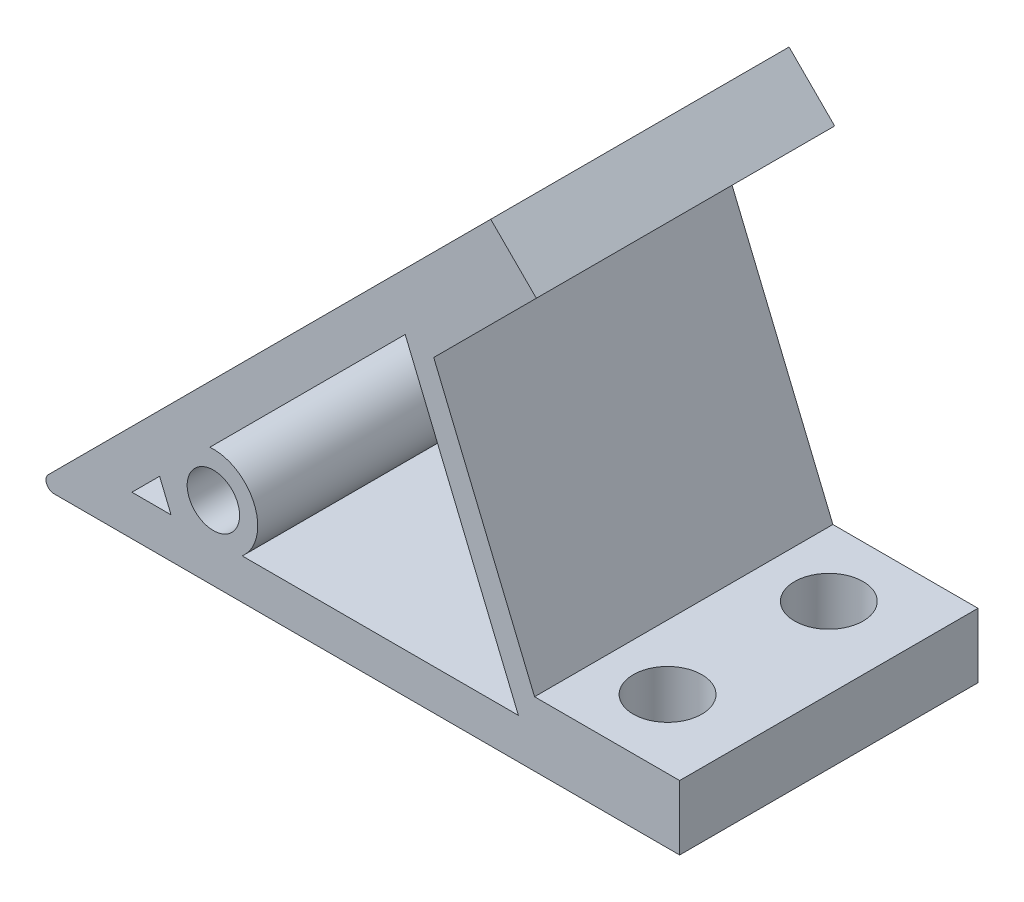
ISO-10303-21;
HEADER;
FILE_DESCRIPTION(('STEP AP214'),'2;1');
FILE_NAME('part.step','',(''),(''),'','','');
FILE_SCHEMA(('AUTOMOTIVE_DESIGN { 1 0 10303 214 1 1 1 1 }'));
ENDSEC;
DATA;
#1=APPLICATION_CONTEXT('core data for automotive mechanical design processes');
#2=APPLICATION_PROTOCOL_DEFINITION('international standard','automotive_design',2000,#1);
#3=PRODUCT_CONTEXT('',#1,'mechanical');
#4=PRODUCT('Part','Part','',(#3));
#5=PRODUCT_RELATED_PRODUCT_CATEGORY('part','',(#4));
#6=PRODUCT_DEFINITION_FORMATION('','',#4);
#7=PRODUCT_DEFINITION_CONTEXT('part definition',#1,'design');
#8=PRODUCT_DEFINITION('design','',#6,#7);
#9=PRODUCT_DEFINITION_SHAPE('','',#8);
#10=(LENGTH_UNIT() NAMED_UNIT(*) SI_UNIT(.MILLI.,.METRE.));
#11=(NAMED_UNIT(*) PLANE_ANGLE_UNIT() SI_UNIT($,.RADIAN.));
#12=(NAMED_UNIT(*) SI_UNIT($,.STERADIAN.) SOLID_ANGLE_UNIT());
#13=UNCERTAINTY_MEASURE_WITH_UNIT(LENGTH_MEASURE(1.E-05),#10,'distance_accuracy_value','');
#14=(GEOMETRIC_REPRESENTATION_CONTEXT(3) GLOBAL_UNCERTAINTY_ASSIGNED_CONTEXT((#13)) GLOBAL_UNIT_ASSIGNED_CONTEXT((#10,
#11,#12)) REPRESENTATION_CONTEXT('',''));
#15=CARTESIAN_POINT('',(0.,0.,0.));
#16=DIRECTION('',(0.,0.,1.));
#17=DIRECTION('',(1.,0.,0.));
#18=AXIS2_PLACEMENT_3D('',#15,#16,#17);
#19=CARTESIAN_POINT('',(-30.4993179415646,38.1869735594505,18.5));
#20=DIRECTION('',(-0.707106781186548,0.707106781186547,0.));
#21=DIRECTION('',(-0.707106781186547,-0.707106781186548,0.));
#22=AXIS2_PLACEMENT_3D('',#19,#20,#21);
#23=PLANE('',#22);
#24=CARTESIAN_POINT('',(-24.8456710674491,43.8406204335659,10.));
#25=DIRECTION('',(-0.70710678118655,0.707106781186545,0.));
#26=DIRECTION('',(-0.707106781186546,-0.707106781186549,0.));
#27=AXIS2_PLACEMENT_3D('',#24,#25,#26);
#28=CIRCLE('',#27,4.25);
#29=CARTESIAN_POINT('',(-27.8508748874919,40.8354166135231,10.));
#30=VERTEX_POINT('',#29);
#31=EDGE_CURVE('E263',#30,#30,#28,.T.);
#32=ORIENTED_EDGE('',*,*,#31,.T.);
#33=EDGE_LOOP('',(#32));
#34=FACE_BOUND('',#33,.T.);
#35=DIRECTION('',(0.707106781186547,0.707106781186548,0.));
#36=VECTOR('',#35,1.);
#37=CARTESIAN_POINT('',(-30.4993179415646,38.1869735594505,-18.5));
#38=LINE('',#37,#36);
#39=CARTESIAN_POINT('',(-30.4993179415646,38.1869735594505,-18.5));
#40=VERTEX_POINT('',#39);
#41=CARTESIAN_POINT('',(-17.7746032555838,50.9116882454314,-18.5));
#42=VERTEX_POINT('',#41);
#43=EDGE_CURVE('E237',#40,#42,#38,.T.);
#44=ORIENTED_EDGE('',*,*,#43,.T.);
#45=DIRECTION('',(0.,0.,-1.));
#46=VECTOR('',#45,1.);
#47=CARTESIAN_POINT('',(-17.7746032555838,50.9116882454314,18.5));
#48=LINE('',#47,#46);
#49=CARTESIAN_POINT('',(-17.7746032555838,50.9116882454314,18.5));
#50=VERTEX_POINT('',#49);
#51=EDGE_CURVE('E247',#50,#42,#48,.T.);
#52=ORIENTED_EDGE('',*,*,#51,.F.);
#53=DIRECTION('',(0.707106781186547,0.707106781186548,0.));
#54=VECTOR('',#53,1.);
#55=CARTESIAN_POINT('',(-30.4993179415646,38.1869735594505,18.5));
#56=LINE('',#55,#54);
#57=CARTESIAN_POINT('',(-30.4993179415646,38.1869735594505,18.5));
#58=VERTEX_POINT('',#57);
#59=EDGE_CURVE('E220',#58,#50,#56,.T.);
#60=ORIENTED_EDGE('',*,*,#59,.F.);
#61=DIRECTION('',(0.,0.,-1.));
#62=VECTOR('',#61,1.);
#63=CARTESIAN_POINT('',(-30.4993179415646,38.1869735594505,18.5));
#64=LINE('',#63,#62);
#65=EDGE_CURVE('E250',#58,#40,#64,.T.);
#66=ORIENTED_EDGE('',*,*,#65,.T.);
#67=EDGE_LOOP('',(#44,#52,#60,#66));
#68=FACE_BOUND('',#67,.T.);
#69=CARTESIAN_POINT('',(-24.8456710674491,43.8406204335659,-9.99999999999999));
#70=DIRECTION('',(-0.70710678118655,0.707106781186545,0.));
#71=DIRECTION('',(0.707106781186546,0.707106781186549,0.));
#72=AXIS2_PLACEMENT_3D('',#69,#70,#71);
#73=CIRCLE('',#72,4.25);
#74=CARTESIAN_POINT('',(-21.8404672474063,46.8458242536088,-9.99999999999999));
#75=VERTEX_POINT('',#74);
#76=EDGE_CURVE('E274',#75,#75,#73,.T.);
#77=ORIENTED_EDGE('',*,*,#76,.T.);
#78=EDGE_LOOP('',(#77));
#79=FACE_BOUND('',#78,.T.);
#80=ADVANCED_FACE('F35',(#34,#68,#79),#23,.F.);
#81=CARTESIAN_POINT('',(-78.2928932188134,1.7071067811866,18.5));
#82=DIRECTION('',(0.707106781186548,-0.707106781186547,0.));
#83=DIRECTION('',(0.707106781186547,0.707106781186548,0.));
#84=AXIS2_PLACEMENT_3D('',#81,#82,#83);
#85=PLANE('',#84);
#86=CARTESIAN_POINT('',(-30.5025253169416,49.4974746830584,10.));
#87=DIRECTION('',(0.707106781186548,-0.707106781186547,0.));
#88=DIRECTION('',(0.707106781186547,0.707106781186548,0.));
#89=AXIS2_PLACEMENT_3D('',#86,#87,#88);
#90=CIRCLE('',#89,4.25);
#91=CARTESIAN_POINT('',(-27.4973214968988,52.5026785031012,10.));
#92=VERTEX_POINT('',#91);
#93=EDGE_CURVE('E260',#92,#92,#90,.F.);
#94=ORIENTED_EDGE('',*,*,#93,.F.);
#95=EDGE_LOOP('',(#94));
#96=FACE_BOUND('',#95,.T.);
#97=DIRECTION('',(-0.707106781186547,-0.707106781186548,0.));
#98=VECTOR('',#97,1.);
#99=CARTESIAN_POINT('',(-78.2928932188134,1.7071067811866,-18.5));
#100=LINE('',#99,#98);
#101=CARTESIAN_POINT('',(-23.4314575050762,56.5685424949238,-18.5));
#102=VERTEX_POINT('',#101);
#103=CARTESIAN_POINT('',(-78.2928932188134,1.7071067811866,-18.5));
#104=VERTEX_POINT('',#103);
#105=EDGE_CURVE('E212',#102,#104,#100,.T.);
#106=ORIENTED_EDGE('',*,*,#105,.T.);
#107=DIRECTION('',(0.,0.,-1.));
#108=VECTOR('',#107,1.);
#109=CARTESIAN_POINT('',(-78.2928932188134,1.7071067811866,18.5));
#110=LINE('',#109,#108);
#111=CARTESIAN_POINT('',(-78.2928932188134,1.7071067811866,18.5));
#112=VERTEX_POINT('',#111);
#113=EDGE_CURVE('E226',#112,#104,#110,.T.);
#114=ORIENTED_EDGE('',*,*,#113,.F.);
#115=DIRECTION('',(-0.707106781186547,-0.707106781186548,0.));
#116=VECTOR('',#115,1.);
#117=CARTESIAN_POINT('',(-78.2928932188134,1.7071067811866,18.5));
#118=LINE('',#117,#116);
#119=CARTESIAN_POINT('',(-23.4314575050762,56.5685424949238,18.5));
#120=VERTEX_POINT('',#119);
#121=EDGE_CURVE('E224',#120,#112,#118,.T.);
#122=ORIENTED_EDGE('',*,*,#121,.F.);
#123=DIRECTION('',(0.,0.,-1.));
#124=VECTOR('',#123,1.);
#125=CARTESIAN_POINT('',(-23.4314575050762,56.5685424949238,18.5));
#126=LINE('',#125,#124);
#127=EDGE_CURVE('E244',#120,#102,#126,.T.);
#128=ORIENTED_EDGE('',*,*,#127,.T.);
#129=EDGE_LOOP('',(#106,#114,#122,#128));
#130=FACE_BOUND('',#129,.T.);
#131=CARTESIAN_POINT('',(-30.5025253169416,49.4974746830584,-9.99999999999999));
#132=DIRECTION('',(0.707106781186548,-0.707106781186547,0.));
#133=DIRECTION('',(0.707106781186547,0.707106781186548,0.));
#134=AXIS2_PLACEMENT_3D('',#131,#132,#133);
#135=CIRCLE('',#134,4.25);
#136=CARTESIAN_POINT('',(-27.4973214968988,52.5026785031012,-9.99999999999999));
#137=VERTEX_POINT('',#136);
#138=EDGE_CURVE('E39',#137,#137,#135,.F.);
#139=ORIENTED_EDGE('',*,*,#138,.F.);
#140=EDGE_LOOP('',(#139));
#141=FACE_BOUND('',#140,.T.);
#142=ADVANCED_FACE('F308',(#96,#130,#141),#85,.F.);
#143=CARTESIAN_POINT('',(-77.5857864376269,1.,18.5));
#144=DIRECTION('',(0.,0.,1.));
#145=DIRECTION('',(1.,0.,0.));
#146=AXIS2_PLACEMENT_3D('',#143,#144,#145);
#147=PLANE('',#146);
#148=DIRECTION('',(1.,0.,0.));
#149=VECTOR('',#148,1.);
#150=CARTESIAN_POINT('',(-54.2574687525298,5.,18.5));
#151=LINE('',#150,#149);
#152=CARTESIAN_POINT('',(-54.2574687525298,5.,18.5));
#153=VERTEX_POINT('',#152);
#154=CARTESIAN_POINT('',(-20.,5.,18.5));
#155=VERTEX_POINT('',#154);
#156=EDGE_CURVE('E152',#153,#155,#151,.T.);
#157=ORIENTED_EDGE('',*,*,#156,.F.);
#158=CARTESIAN_POINT('',(-57.8268912197291,9.18440237676214,18.5));
#159=DIRECTION('',(0.,0.,-1.));
#160=DIRECTION('',(1.,0.,0.));
#161=AXIS2_PLACEMENT_3D('',#158,#159,#160);
#162=CIRCLE('',#161,5.49999999999996);
#163=CARTESIAN_POINT('',(-58.2617476840749,14.6671845040599,18.5));
#164=VERTEX_POINT('',#163);
#165=EDGE_CURVE('E144',#164,#153,#162,.T.);
#166=ORIENTED_EDGE('',*,*,#165,.F.);
#167=DIRECTION('',(-0.707106781186549,-0.707106781186546,0.));
#168=VECTOR('',#167,1.);
#169=CARTESIAN_POINT('',(-58.2617476840749,14.6671845040599,18.5));
#170=LINE('',#169,#168);
#171=CARTESIAN_POINT('',(-34.0380592228744,38.8908729652603,18.5));
#172=VERTEX_POINT('',#171);
#173=EDGE_CURVE('E168',#172,#164,#170,.T.);
#174=ORIENTED_EDGE('',*,*,#173,.F.);
#175=DIRECTION('',(-0.382683432365087,0.923879532511288,0.));
#176=VECTOR('',#175,1.);
#177=CARTESIAN_POINT('',(-20.,5.,18.5));
#178=LINE('',#177,#176);
#179=EDGE_CURVE('E166',#155,#172,#178,.T.);
#180=ORIENTED_EDGE('',*,*,#179,.F.);
#181=EDGE_LOOP('',(#157,#166,#174,#180));
#182=FACE_BOUND('',#181,.T.);
#183=CARTESIAN_POINT('',(-77.5857864376269,1.,18.5));
#184=DIRECTION('',(0.,0.,1.));
#185=DIRECTION('',(1.,0.,0.));
#186=AXIS2_PLACEMENT_3D('',#183,#184,#185);
#187=CIRCLE('',#186,1.);
#188=CARTESIAN_POINT('',(-77.5857864376269,0.,18.5));
#189=VERTEX_POINT('',#188);
#190=EDGE_CURVE('E208',#112,#189,#187,.T.);
#191=ORIENTED_EDGE('',*,*,#190,.T.);
#192=DIRECTION('',(1.,0.,0.));
#193=VECTOR('',#192,1.);
#194=CARTESIAN_POINT('',(-77.5857864376269,0.,18.5));
#195=LINE('',#194,#193);
#196=CARTESIAN_POINT('',(0.,0.,18.5));
#197=VERTEX_POINT('',#196);
#198=EDGE_CURVE('E211',#189,#197,#195,.T.);
#199=ORIENTED_EDGE('',*,*,#198,.T.);
#200=DIRECTION('',(0.,1.,0.));
#201=VECTOR('',#200,1.);
#202=CARTESIAN_POINT('',(0.,0.,18.5));
#203=LINE('',#202,#201);
#204=CARTESIAN_POINT('',(0.,8.,18.5));
#205=VERTEX_POINT('',#204);
#206=EDGE_CURVE('E214',#197,#205,#203,.T.);
#207=ORIENTED_EDGE('',*,*,#206,.T.);
#208=DIRECTION('',(-1.,0.,0.));
#209=VECTOR('',#208,1.);
#210=CARTESIAN_POINT('',(-17.995464086242,8.00000000000012,18.5));
#211=LINE('',#210,#209);
#212=CARTESIAN_POINT('',(-17.995464086242,8.00000000000012,18.5));
#213=VERTEX_POINT('',#212);
#214=EDGE_CURVE('E216',#205,#213,#211,.T.);
#215=ORIENTED_EDGE('',*,*,#214,.T.);
#216=DIRECTION('',(-0.382683432365096,0.923879532511284,0.));
#217=VECTOR('',#216,1.);
#218=CARTESIAN_POINT('',(-17.995464086242,8.00000000000012,18.5));
#219=LINE('',#218,#217);
#220=EDGE_CURVE('E218',#213,#58,#219,.T.);
#221=ORIENTED_EDGE('',*,*,#220,.T.);
#222=ORIENTED_EDGE('',*,*,#59,.T.);
#223=DIRECTION('',(-0.707106781186548,0.707106781186547,0.));
#224=VECTOR('',#223,1.);
#225=CARTESIAN_POINT('',(-17.7746032555838,50.9116882454314,18.5));
#226=LINE('',#225,#224);
#227=EDGE_CURVE('E222',#50,#120,#226,.T.);
#228=ORIENTED_EDGE('',*,*,#227,.T.);
#229=ORIENTED_EDGE('',*,*,#121,.T.);
#230=EDGE_LOOP('',(#191,#199,#207,#215,#221,#222,#228,#229));
#231=FACE_BOUND('',#230,.T.);
#232=DIRECTION('',(1.,0.,0.));
#233=VECTOR('',#232,1.);
#234=CARTESIAN_POINT('',(-67.9289321881347,5.,18.5));
#235=LINE('',#234,#233);
#236=CARTESIAN_POINT('',(-67.9289321881347,5.,18.5));
#237=VERTEX_POINT('',#236);
#238=CARTESIAN_POINT('',(-63.0744704704145,5.00000000000011,18.5));
#239=VERTEX_POINT('',#238);
#240=EDGE_CURVE('E186',#237,#239,#235,.T.);
#241=ORIENTED_EDGE('',*,*,#240,.F.);
#242=DIRECTION('',(-0.70710678118656,-0.707106781186535,0.));
#243=VECTOR('',#242,1.);
#244=CARTESIAN_POINT('',(-67.9289321881347,5.,18.5));
#245=LINE('',#244,#243);
#246=CARTESIAN_POINT('',(-64.4963093885244,8.43262279961016,18.5));
#247=VERTEX_POINT('',#246);
#248=EDGE_CURVE('E184',#247,#237,#245,.T.);
#249=ORIENTED_EDGE('',*,*,#248,.F.);
#250=DIRECTION('',(-0.382683432365157,0.923879532511259,0.));
#251=VECTOR('',#250,1.);
#252=CARTESIAN_POINT('',(-63.0744704704145,5.00000000000011,18.5));
#253=LINE('',#252,#251);
#254=EDGE_CURVE('E190',#239,#247,#253,.T.);
#255=ORIENTED_EDGE('',*,*,#254,.F.);
#256=EDGE_LOOP('',(#241,#249,#255));
#257=FACE_BOUND('',#256,.T.);
#258=CARTESIAN_POINT('',(-57.8268912197291,9.18440237676214,18.5));
#259=DIRECTION('',(0.,0.,1.));
#260=DIRECTION('',(1.,0.,0.));
#261=AXIS2_PLACEMENT_3D('',#258,#259,#260);
#262=CIRCLE('',#261,3.25);
#263=CARTESIAN_POINT('',(-54.5768912197291,9.18440237676214,18.5));
#264=VERTEX_POINT('',#263);
#265=EDGE_CURVE('E174',#264,#264,#262,.T.);
#266=ORIENTED_EDGE('',*,*,#265,.F.);
#267=EDGE_LOOP('',(#266));
#268=FACE_BOUND('',#267,.T.);
#269=ADVANCED_FACE('F164',(#182,#231,#257,#268),#147,.T.);
#270=CARTESIAN_POINT('',(-77.5857864376269,1.,-18.5));
#271=DIRECTION('',(0.,0.,1.));
#272=DIRECTION('',(1.,0.,0.));
#273=AXIS2_PLACEMENT_3D('',#270,#271,#272);
#274=PLANE('',#273);
#275=CARTESIAN_POINT('',(-57.8268912197291,9.18440237676214,-18.5));
#276=DIRECTION('',(0.,0.,-1.));
#277=DIRECTION('',(1.,0.,0.));
#278=AXIS2_PLACEMENT_3D('',#275,#276,#277);
#279=CIRCLE('',#278,5.49999999999996);
#280=CARTESIAN_POINT('',(-58.2617476840749,14.6671845040599,-18.5));
#281=VERTEX_POINT('',#280);
#282=CARTESIAN_POINT('',(-54.2574687525298,5.,-18.5));
#283=VERTEX_POINT('',#282);
#284=EDGE_CURVE('E60',#281,#283,#279,.T.);
#285=ORIENTED_EDGE('',*,*,#284,.T.);
#286=DIRECTION('',(1.,0.,0.));
#287=VECTOR('',#286,1.);
#288=CARTESIAN_POINT('',(-54.2574687525298,5.,-18.5));
#289=LINE('',#288,#287);
#290=CARTESIAN_POINT('',(-20.,5.,-18.5));
#291=VERTEX_POINT('',#290);
#292=EDGE_CURVE('E159',#283,#291,#289,.T.);
#293=ORIENTED_EDGE('',*,*,#292,.T.);
#294=DIRECTION('',(-0.382683432365087,0.923879532511288,0.));
#295=VECTOR('',#294,1.);
#296=CARTESIAN_POINT('',(-20.,5.,-18.5));
#297=LINE('',#296,#295);
#298=CARTESIAN_POINT('',(-34.0380592228744,38.8908729652603,-18.5));
#299=VERTEX_POINT('',#298);
#300=EDGE_CURVE('E176',#291,#299,#297,.T.);
#301=ORIENTED_EDGE('',*,*,#300,.T.);
#302=DIRECTION('',(-0.707106781186549,-0.707106781186546,0.));
#303=VECTOR('',#302,1.);
#304=CARTESIAN_POINT('',(-58.2617476840749,14.6671845040599,-18.5));
#305=LINE('',#304,#303);
#306=EDGE_CURVE('E153',#299,#281,#305,.T.);
#307=ORIENTED_EDGE('',*,*,#306,.T.);
#308=EDGE_LOOP('',(#285,#293,#301,#307));
#309=FACE_BOUND('',#308,.T.);
#310=CARTESIAN_POINT('',(-77.5857864376269,1.,-18.5));
#311=DIRECTION('',(0.,0.,1.));
#312=DIRECTION('',(1.,0.,0.));
#313=AXIS2_PLACEMENT_3D('',#310,#311,#312);
#314=CIRCLE('',#313,1.);
#315=CARTESIAN_POINT('',(-77.5857864376269,0.,-18.5));
#316=VERTEX_POINT('',#315);
#317=EDGE_CURVE('E207',#104,#316,#314,.T.);
#318=ORIENTED_EDGE('',*,*,#317,.F.);
#319=ORIENTED_EDGE('',*,*,#105,.F.);
#320=DIRECTION('',(-0.707106781186548,0.707106781186547,0.));
#321=VECTOR('',#320,1.);
#322=CARTESIAN_POINT('',(-17.7746032555838,50.9116882454314,-18.5));
#323=LINE('',#322,#321);
#324=EDGE_CURVE('E239',#42,#102,#323,.T.);
#325=ORIENTED_EDGE('',*,*,#324,.F.);
#326=ORIENTED_EDGE('',*,*,#43,.F.);
#327=DIRECTION('',(-0.382683432365096,0.923879532511284,0.));
#328=VECTOR('',#327,1.);
#329=CARTESIAN_POINT('',(-17.995464086242,8.00000000000012,-18.5));
#330=LINE('',#329,#328);
#331=CARTESIAN_POINT('',(-17.995464086242,8.00000000000012,-18.5));
#332=VERTEX_POINT('',#331);
#333=EDGE_CURVE('E235',#332,#40,#330,.T.);
#334=ORIENTED_EDGE('',*,*,#333,.F.);
#335=DIRECTION('',(-1.,0.,0.));
#336=VECTOR('',#335,1.);
#337=CARTESIAN_POINT('',(-17.995464086242,8.00000000000012,-18.5));
#338=LINE('',#337,#336);
#339=CARTESIAN_POINT('',(0.,8.,-18.5));
#340=VERTEX_POINT('',#339);
#341=EDGE_CURVE('E233',#340,#332,#338,.T.);
#342=ORIENTED_EDGE('',*,*,#341,.F.);
#343=DIRECTION('',(0.,1.,0.));
#344=VECTOR('',#343,1.);
#345=CARTESIAN_POINT('',(0.,0.,-18.5));
#346=LINE('',#345,#344);
#347=CARTESIAN_POINT('',(0.,0.,-18.5));
#348=VERTEX_POINT('',#347);
#349=EDGE_CURVE('E231',#348,#340,#346,.T.);
#350=ORIENTED_EDGE('',*,*,#349,.F.);
#351=DIRECTION('',(1.,0.,0.));
#352=VECTOR('',#351,1.);
#353=CARTESIAN_POINT('',(-77.5857864376269,0.,-18.5));
#354=LINE('',#353,#352);
#355=EDGE_CURVE('E229',#316,#348,#354,.T.);
#356=ORIENTED_EDGE('',*,*,#355,.F.);
#357=EDGE_LOOP('',(#318,#319,#325,#326,#334,#342,#350,#356));
#358=FACE_BOUND('',#357,.T.);
#359=DIRECTION('',(-0.70710678118656,-0.707106781186535,0.));
#360=VECTOR('',#359,1.);
#361=CARTESIAN_POINT('',(-67.9289321881347,5.,-18.5));
#362=LINE('',#361,#360);
#363=CARTESIAN_POINT('',(-64.4963093885244,8.43262279961016,-18.5));
#364=VERTEX_POINT('',#363);
#365=CARTESIAN_POINT('',(-67.9289321881347,5.,-18.5));
#366=VERTEX_POINT('',#365);
#367=EDGE_CURVE('E160',#364,#366,#362,.T.);
#368=ORIENTED_EDGE('',*,*,#367,.T.);
#369=DIRECTION('',(1.,0.,0.));
#370=VECTOR('',#369,1.);
#371=CARTESIAN_POINT('',(-67.9289321881347,5.,-18.5));
#372=LINE('',#371,#370);
#373=CARTESIAN_POINT('',(-63.0744704704145,5.00000000000011,-18.5));
#374=VERTEX_POINT('',#373);
#375=EDGE_CURVE('E195',#366,#374,#372,.T.);
#376=ORIENTED_EDGE('',*,*,#375,.T.);
#377=DIRECTION('',(-0.382683432365157,0.923879532511259,0.));
#378=VECTOR('',#377,1.);
#379=CARTESIAN_POINT('',(-63.0744704704145,5.00000000000011,-18.5));
#380=LINE('',#379,#378);
#381=EDGE_CURVE('E187',#374,#364,#380,.T.);
#382=ORIENTED_EDGE('',*,*,#381,.T.);
#383=EDGE_LOOP('',(#368,#376,#382));
#384=FACE_BOUND('',#383,.T.);
#385=CARTESIAN_POINT('',(-57.8268912197291,9.18440237676214,-18.5));
#386=DIRECTION('',(0.,0.,1.));
#387=DIRECTION('',(1.,0.,0.));
#388=AXIS2_PLACEMENT_3D('',#385,#386,#387);
#389=CIRCLE('',#388,3.25);
#390=CARTESIAN_POINT('',(-54.5768912197291,9.18440237676214,-18.5));
#391=VERTEX_POINT('',#390);
#392=EDGE_CURVE('E285',#391,#391,#389,.T.);
#393=ORIENTED_EDGE('',*,*,#392,.T.);
#394=EDGE_LOOP('',(#393));
#395=FACE_BOUND('',#394,.T.);
#396=ADVANCED_FACE('F290',(#309,#358,#384,#395),#274,.F.);
#397=CARTESIAN_POINT('',(-77.5857864376269,1.,18.5));
#398=DIRECTION('',(0.,0.,-1.));
#399=DIRECTION('',(-1.,0.,0.));
#400=AXIS2_PLACEMENT_3D('',#397,#398,#399);
#401=CYLINDRICAL_SURFACE('',#400,1.);
#402=ORIENTED_EDGE('',*,*,#317,.T.);
#403=DIRECTION('',(0.,0.,-1.));
#404=VECTOR('',#403,1.);
#405=CARTESIAN_POINT('',(-77.5857864376269,0.,18.5));
#406=LINE('',#405,#404);
#407=EDGE_CURVE('E11',#189,#316,#406,.T.);
#408=ORIENTED_EDGE('',*,*,#407,.F.);
#409=ORIENTED_EDGE('',*,*,#190,.F.);
#410=ORIENTED_EDGE('',*,*,#113,.T.);
#411=EDGE_LOOP('',(#402,#408,#409,#410));
#412=FACE_BOUND('',#411,.T.);
#413=ADVANCED_FACE('F37',(#412),#401,.T.);
#414=CARTESIAN_POINT('',(-77.5857864376269,0.,18.5));
#415=DIRECTION('',(0.,1.,0.));
#416=DIRECTION('',(0.,0.,1.));
#417=AXIS2_PLACEMENT_3D('',#414,#415,#416);
#418=PLANE('',#417);
#419=CARTESIAN_POINT('',(-10.,0.,-9.99999999999999));
#420=DIRECTION('',(0.,1.,0.));
#421=DIRECTION('',(0.,0.,1.));
#422=AXIS2_PLACEMENT_3D('',#419,#420,#421);
#423=CIRCLE('',#422,4.25);
#424=CARTESIAN_POINT('',(-10.,0.,-5.74999999999999));
#425=VERTEX_POINT('',#424);
#426=EDGE_CURVE('E267',#425,#425,#423,.T.);
#427=ORIENTED_EDGE('',*,*,#426,.T.);
#428=EDGE_LOOP('',(#427));
#429=FACE_BOUND('',#428,.T.);
#430=CARTESIAN_POINT('',(-10.,0.,10.));
#431=DIRECTION('',(0.,1.,0.));
#432=DIRECTION('',(0.,0.,1.));
#433=AXIS2_PLACEMENT_3D('',#430,#431,#432);
#434=CIRCLE('',#433,4.25);
#435=CARTESIAN_POINT('',(-10.,0.,14.25));
#436=VERTEX_POINT('',#435);
#437=EDGE_CURVE('E282',#436,#436,#434,.T.);
#438=ORIENTED_EDGE('',*,*,#437,.T.);
#439=EDGE_LOOP('',(#438));
#440=FACE_BOUND('',#439,.T.);
#441=ORIENTED_EDGE('',*,*,#355,.T.);
#442=DIRECTION('',(0.,0.,-1.));
#443=VECTOR('',#442,1.);
#444=CARTESIAN_POINT('',(0.,0.,18.5));
#445=LINE('',#444,#443);
#446=EDGE_CURVE('E44',#197,#348,#445,.T.);
#447=ORIENTED_EDGE('',*,*,#446,.F.);
#448=ORIENTED_EDGE('',*,*,#198,.F.);
#449=ORIENTED_EDGE('',*,*,#407,.T.);
#450=EDGE_LOOP('',(#441,#447,#448,#449));
#451=FACE_BOUND('',#450,.T.);
#452=ADVANCED_FACE('F329',(#429,#440,#451),#418,.F.);
#453=CARTESIAN_POINT('',(0.,0.,18.5));
#454=DIRECTION('',(-1.,0.,0.));
#455=DIRECTION('',(0.,0.,1.));
#456=AXIS2_PLACEMENT_3D('',#453,#454,#455);
#457=PLANE('',#456);
#458=ORIENTED_EDGE('',*,*,#349,.T.);
#459=DIRECTION('',(0.,0.,-1.));
#460=VECTOR('',#459,1.);
#461=CARTESIAN_POINT('',(0.,8.,18.5));
#462=LINE('',#461,#460);
#463=EDGE_CURVE('E256',#205,#340,#462,.T.);
#464=ORIENTED_EDGE('',*,*,#463,.F.);
#465=ORIENTED_EDGE('',*,*,#206,.F.);
#466=ORIENTED_EDGE('',*,*,#446,.T.);
#467=EDGE_LOOP('',(#458,#464,#465,#466));
#468=FACE_BOUND('',#467,.T.);
#469=ADVANCED_FACE('F326',(#468),#457,.F.);
#470=CARTESIAN_POINT('',(-17.995464086242,8.00000000000012,18.5));
#471=DIRECTION('',(0.,-1.,0.));
#472=DIRECTION('',(1.,0.,0.));
#473=AXIS2_PLACEMENT_3D('',#470,#471,#472);
#474=PLANE('',#473);
#475=CARTESIAN_POINT('',(-9.99999999999995,8.00000000000006,-9.99999999999999));
#476=DIRECTION('',(0.,1.,0.));
#477=DIRECTION('',(1.,0.,0.));
#478=AXIS2_PLACEMENT_3D('',#475,#476,#477);
#479=CIRCLE('',#478,4.25);
#480=CARTESIAN_POINT('',(-5.74999999999995,8.00000000000004,-9.99999999999999));
#481=VERTEX_POINT('',#480);
#482=EDGE_CURVE('E262',#481,#481,#479,.T.);
#483=ORIENTED_EDGE('',*,*,#482,.F.);
#484=EDGE_LOOP('',(#483));
#485=FACE_BOUND('',#484,.T.);
#486=CARTESIAN_POINT('',(-9.99999999999995,8.00000000000006,10.));
#487=DIRECTION('',(0.,1.,0.));
#488=DIRECTION('',(-1.,0.,0.));
#489=AXIS2_PLACEMENT_3D('',#486,#487,#488);
#490=CIRCLE('',#489,4.25);
#491=CARTESIAN_POINT('',(-14.25,8.00000000000009,10.));
#492=VERTEX_POINT('',#491);
#493=EDGE_CURVE('E279',#492,#492,#490,.T.);
#494=ORIENTED_EDGE('',*,*,#493,.F.);
#495=EDGE_LOOP('',(#494));
#496=FACE_BOUND('',#495,.T.);
#497=ORIENTED_EDGE('',*,*,#341,.T.);
#498=DIRECTION('',(0.,0.,-1.));
#499=VECTOR('',#498,1.);
#500=CARTESIAN_POINT('',(-17.995464086242,8.00000000000012,18.5));
#501=LINE('',#500,#499);
#502=EDGE_CURVE('E253',#213,#332,#501,.T.);
#503=ORIENTED_EDGE('',*,*,#502,.F.);
#504=ORIENTED_EDGE('',*,*,#214,.F.);
#505=ORIENTED_EDGE('',*,*,#463,.T.);
#506=EDGE_LOOP('',(#497,#503,#504,#505));
#507=FACE_BOUND('',#506,.T.);
#508=ADVANCED_FACE('F322',(#485,#496,#507),#474,.F.);
#509=CARTESIAN_POINT('',(-17.995464086242,8.00000000000012,18.5));
#510=DIRECTION('',(-0.923879532511284,-0.382683432365096,0.));
#511=DIRECTION('',(0.382683432365096,-0.923879532511284,0.));
#512=AXIS2_PLACEMENT_3D('',#509,#510,#511);
#513=PLANE('',#512);
#514=ORIENTED_EDGE('',*,*,#333,.T.);
#515=ORIENTED_EDGE('',*,*,#65,.F.);
#516=ORIENTED_EDGE('',*,*,#220,.F.);
#517=ORIENTED_EDGE('',*,*,#502,.T.);
#518=EDGE_LOOP('',(#514,#515,#516,#517));
#519=FACE_BOUND('',#518,.T.);
#520=ADVANCED_FACE('F319',(#519),#513,.F.);
#521=CARTESIAN_POINT('',(-17.7746032555838,50.9116882454314,18.5));
#522=DIRECTION('',(-0.707106781186547,-0.707106781186548,0.));
#523=DIRECTION('',(0.707106781186548,-0.707106781186547,0.));
#524=AXIS2_PLACEMENT_3D('',#521,#522,#523);
#525=PLANE('',#524);
#526=ORIENTED_EDGE('',*,*,#324,.T.);
#527=ORIENTED_EDGE('',*,*,#127,.F.);
#528=ORIENTED_EDGE('',*,*,#227,.F.);
#529=ORIENTED_EDGE('',*,*,#51,.T.);
#530=EDGE_LOOP('',(#526,#527,#528,#529));
#531=FACE_BOUND('',#530,.T.);
#532=ADVANCED_FACE('F318',(#531),#525,.F.);
#533=CARTESIAN_POINT('',(-67.9289321881347,5.,18.5));
#534=DIRECTION('',(0.707106781186535,-0.70710678118656,0.));
#535=DIRECTION('',(0.70710678118656,0.707106781186535,0.));
#536=AXIS2_PLACEMENT_3D('',#533,#534,#535);
#537=PLANE('',#536);
#538=ORIENTED_EDGE('',*,*,#367,.F.);
#539=DIRECTION('',(0.,0.,-1.));
#540=VECTOR('',#539,1.);
#541=CARTESIAN_POINT('',(-64.4963093885244,8.43262279961016,18.5));
#542=LINE('',#541,#540);
#543=EDGE_CURVE('E192',#247,#364,#542,.T.);
#544=ORIENTED_EDGE('',*,*,#543,.F.);
#545=ORIENTED_EDGE('',*,*,#248,.T.);
#546=DIRECTION('',(0.,0.,-1.));
#547=VECTOR('',#546,1.);
#548=CARTESIAN_POINT('',(-67.9289321881347,5.,18.5));
#549=LINE('',#548,#547);
#550=EDGE_CURVE('E204',#237,#366,#549,.T.);
#551=ORIENTED_EDGE('',*,*,#550,.T.);
#552=EDGE_LOOP('',(#538,#544,#545,#551));
#553=FACE_BOUND('',#552,.T.);
#554=ADVANCED_FACE('F457',(#553),#537,.T.);
#555=CARTESIAN_POINT('',(-67.9289321881347,5.,18.5));
#556=DIRECTION('',(0.,1.,0.));
#557=DIRECTION('',(-1.,0.,0.));
#558=AXIS2_PLACEMENT_3D('',#555,#556,#557);
#559=PLANE('',#558);
#560=ORIENTED_EDGE('',*,*,#375,.F.);
#561=ORIENTED_EDGE('',*,*,#550,.F.);
#562=ORIENTED_EDGE('',*,*,#240,.T.);
#563=DIRECTION('',(0.,0.,-1.));
#564=VECTOR('',#563,1.);
#565=CARTESIAN_POINT('',(-63.0744704704145,5.00000000000011,18.5));
#566=LINE('',#565,#564);
#567=EDGE_CURVE('E202',#239,#374,#566,.T.);
#568=ORIENTED_EDGE('',*,*,#567,.T.);
#569=EDGE_LOOP('',(#560,#561,#562,#568));
#570=FACE_BOUND('',#569,.T.);
#571=ADVANCED_FACE('F465',(#570),#559,.T.);
#572=CARTESIAN_POINT('',(-63.0744704704145,5.00000000000011,18.5));
#573=DIRECTION('',(-0.923879532511259,-0.382683432365157,0.));
#574=DIRECTION('',(0.382683432365157,-0.923879532511259,0.));
#575=AXIS2_PLACEMENT_3D('',#572,#573,#574);
#576=PLANE('',#575);
#577=ORIENTED_EDGE('',*,*,#381,.F.);
#578=ORIENTED_EDGE('',*,*,#567,.F.);
#579=ORIENTED_EDGE('',*,*,#254,.T.);
#580=ORIENTED_EDGE('',*,*,#543,.T.);
#581=EDGE_LOOP('',(#577,#578,#579,#580));
#582=FACE_BOUND('',#581,.T.);
#583=ADVANCED_FACE('F475',(#582),#576,.T.);
#584=CARTESIAN_POINT('',(-57.8268912197291,9.18440237676214,18.5));
#585=DIRECTION('',(0.,0.,-1.));
#586=DIRECTION('',(-1.,0.,0.));
#587=AXIS2_PLACEMENT_3D('',#584,#585,#586);
#588=CYLINDRICAL_SURFACE('',#587,5.49999999999996);
#589=ORIENTED_EDGE('',*,*,#284,.F.);
#590=DIRECTION('',(0.,0.,-1.));
#591=VECTOR('',#590,1.);
#592=CARTESIAN_POINT('',(-58.2617476840749,14.6671845040599,18.5));
#593=LINE('',#592,#591);
#594=EDGE_CURVE('E148',#164,#281,#593,.T.);
#595=ORIENTED_EDGE('',*,*,#594,.F.);
#596=ORIENTED_EDGE('',*,*,#165,.T.);
#597=DIRECTION('',(0.,0.,-1.));
#598=VECTOR('',#597,1.);
#599=CARTESIAN_POINT('',(-54.2574687525298,5.,18.5));
#600=LINE('',#599,#598);
#601=EDGE_CURVE('E147',#153,#283,#600,.T.);
#602=ORIENTED_EDGE('',*,*,#601,.T.);
#603=EDGE_LOOP('',(#589,#595,#596,#602));
#604=FACE_BOUND('',#603,.T.);
#605=ADVANCED_FACE('F146',(#604),#588,.T.);
#606=CARTESIAN_POINT('',(-54.2574687525298,5.,18.5));
#607=DIRECTION('',(0.,1.,0.));
#608=DIRECTION('',(0.,0.,1.));
#609=AXIS2_PLACEMENT_3D('',#606,#607,#608);
#610=PLANE('',#609);
#611=ORIENTED_EDGE('',*,*,#292,.F.);
#612=ORIENTED_EDGE('',*,*,#601,.F.);
#613=ORIENTED_EDGE('',*,*,#156,.T.);
#614=DIRECTION('',(0.,0.,-1.));
#615=VECTOR('',#614,1.);
#616=CARTESIAN_POINT('',(-20.,5.,18.5));
#617=LINE('',#616,#615);
#618=EDGE_CURVE('E161',#155,#291,#617,.T.);
#619=ORIENTED_EDGE('',*,*,#618,.T.);
#620=EDGE_LOOP('',(#611,#612,#613,#619));
#621=FACE_BOUND('',#620,.T.);
#622=ADVANCED_FACE('F156',(#621),#610,.T.);
#623=CARTESIAN_POINT('',(-20.,5.,18.5));
#624=DIRECTION('',(-0.923879532511288,-0.382683432365087,0.));
#625=DIRECTION('',(0.382683432365087,-0.923879532511288,0.));
#626=AXIS2_PLACEMENT_3D('',#623,#624,#625);
#627=PLANE('',#626);
#628=ORIENTED_EDGE('',*,*,#300,.F.);
#629=ORIENTED_EDGE('',*,*,#618,.F.);
#630=ORIENTED_EDGE('',*,*,#179,.T.);
#631=DIRECTION('',(0.,0.,-1.));
#632=VECTOR('',#631,1.);
#633=CARTESIAN_POINT('',(-34.0380592228744,38.8908729652603,18.5));
#634=LINE('',#633,#632);
#635=EDGE_CURVE('E52',#172,#299,#634,.T.);
#636=ORIENTED_EDGE('',*,*,#635,.T.);
#637=EDGE_LOOP('',(#628,#629,#630,#636));
#638=FACE_BOUND('',#637,.T.);
#639=ADVANCED_FACE('F305',(#638),#627,.T.);
#640=CARTESIAN_POINT('',(-58.2617476840749,14.6671845040599,18.5));
#641=DIRECTION('',(0.707106781186546,-0.707106781186549,0.));
#642=DIRECTION('',(0.707106781186549,0.707106781186546,0.));
#643=AXIS2_PLACEMENT_3D('',#640,#641,#642);
#644=PLANE('',#643);
#645=ORIENTED_EDGE('',*,*,#306,.F.);
#646=ORIENTED_EDGE('',*,*,#635,.F.);
#647=ORIENTED_EDGE('',*,*,#173,.T.);
#648=ORIENTED_EDGE('',*,*,#594,.T.);
#649=EDGE_LOOP('',(#645,#646,#647,#648));
#650=FACE_BOUND('',#649,.T.);
#651=ADVANCED_FACE('F295',(#650),#644,.T.);
#652=CARTESIAN_POINT('',(-57.8268912197291,9.18440237676214,18.5));
#653=DIRECTION('',(0.,0.,-1.));
#654=DIRECTION('',(-1.,0.,0.));
#655=AXIS2_PLACEMENT_3D('',#652,#653,#654);
#656=CYLINDRICAL_SURFACE('',#655,3.25);
#657=ORIENTED_EDGE('',*,*,#265,.T.);
#658=EDGE_LOOP('',(#657));
#659=FACE_BOUND('',#658,.T.);
#660=ORIENTED_EDGE('',*,*,#392,.F.);
#661=EDGE_LOOP('',(#660));
#662=FACE_BOUND('',#661,.T.);
#663=ADVANCED_FACE('F292',(#659,#662),#656,.F.);
#664=CARTESIAN_POINT('',(-10.0000000000001,-8.99999999999994,10.));
#665=DIRECTION('',(0.,1.,0.));
#666=DIRECTION('',(-1.,0.,0.));
#667=AXIS2_PLACEMENT_3D('',#664,#665,#666);
#668=CYLINDRICAL_SURFACE('',#667,4.25);
#669=ORIENTED_EDGE('',*,*,#493,.T.);
#670=EDGE_LOOP('',(#669));
#671=FACE_BOUND('',#670,.T.);
#672=ORIENTED_EDGE('',*,*,#437,.F.);
#673=EDGE_LOOP('',(#672));
#674=FACE_BOUND('',#673,.T.);
#675=ADVANCED_FACE('F294',(#671,#674),#668,.F.);
#676=CARTESIAN_POINT('',(-10.0000000000001,-8.99999999999994,-9.99999999999999));
#677=DIRECTION('',(0.,1.,0.));
#678=DIRECTION('',(-1.,0.,0.));
#679=AXIS2_PLACEMENT_3D('',#676,#677,#678);
#680=CYLINDRICAL_SURFACE('',#679,4.25);
#681=ORIENTED_EDGE('',*,*,#482,.T.);
#682=EDGE_LOOP('',(#681));
#683=FACE_BOUND('',#682,.T.);
#684=ORIENTED_EDGE('',*,*,#426,.F.);
#685=EDGE_LOOP('',(#684));
#686=FACE_BOUND('',#685,.T.);
#687=ADVANCED_FACE('F302',(#683,#686),#680,.F.);
#688=CARTESIAN_POINT('',(-36.8664863476205,55.8614357137372,10.));
#689=DIRECTION('',(0.70710678118655,-0.707106781186545,0.));
#690=DIRECTION('',(0.707106781186545,0.70710678118655,0.));
#691=AXIS2_PLACEMENT_3D('',#688,#689,#690);
#692=CYLINDRICAL_SURFACE('',#691,4.25);
#693=ORIENTED_EDGE('',*,*,#31,.F.);
#694=EDGE_LOOP('',(#693));
#695=FACE_BOUND('',#694,.T.);
#696=ORIENTED_EDGE('',*,*,#93,.T.);
#697=EDGE_LOOP('',(#696));
#698=FACE_BOUND('',#697,.T.);
#699=ADVANCED_FACE('F377',(#695,#698),#692,.F.);
#700=CARTESIAN_POINT('',(-36.8664863476205,55.8614357137372,-9.99999999999999));
#701=DIRECTION('',(0.70710678118655,-0.707106781186545,0.));
#702=DIRECTION('',(0.707106781186545,0.70710678118655,0.));
#703=AXIS2_PLACEMENT_3D('',#700,#701,#702);
#704=CYLINDRICAL_SURFACE('',#703,4.25);
#705=ORIENTED_EDGE('',*,*,#76,.F.);
#706=EDGE_LOOP('',(#705));
#707=FACE_BOUND('',#706,.T.);
#708=ORIENTED_EDGE('',*,*,#138,.T.);
#709=EDGE_LOOP('',(#708));
#710=FACE_BOUND('',#709,.T.);
#711=ADVANCED_FACE('F374',(#707,#710),#704,.F.);
#712=CLOSED_SHELL('',(#80,#142,#269,#396,#413,#452,#469,#508,#520,#532,#554,#571,#583,#605,#622,
#639,#651,#663,#675,#687,#699,#711));
#713=MANIFOLD_SOLID_BREP('B2',#712);
#714=ADVANCED_BREP_SHAPE_REPRESENTATION('',(#18,#713),#14);
#715=SHAPE_DEFINITION_REPRESENTATION(#9,#714);
ENDSEC;
END-ISO-10303-21;
